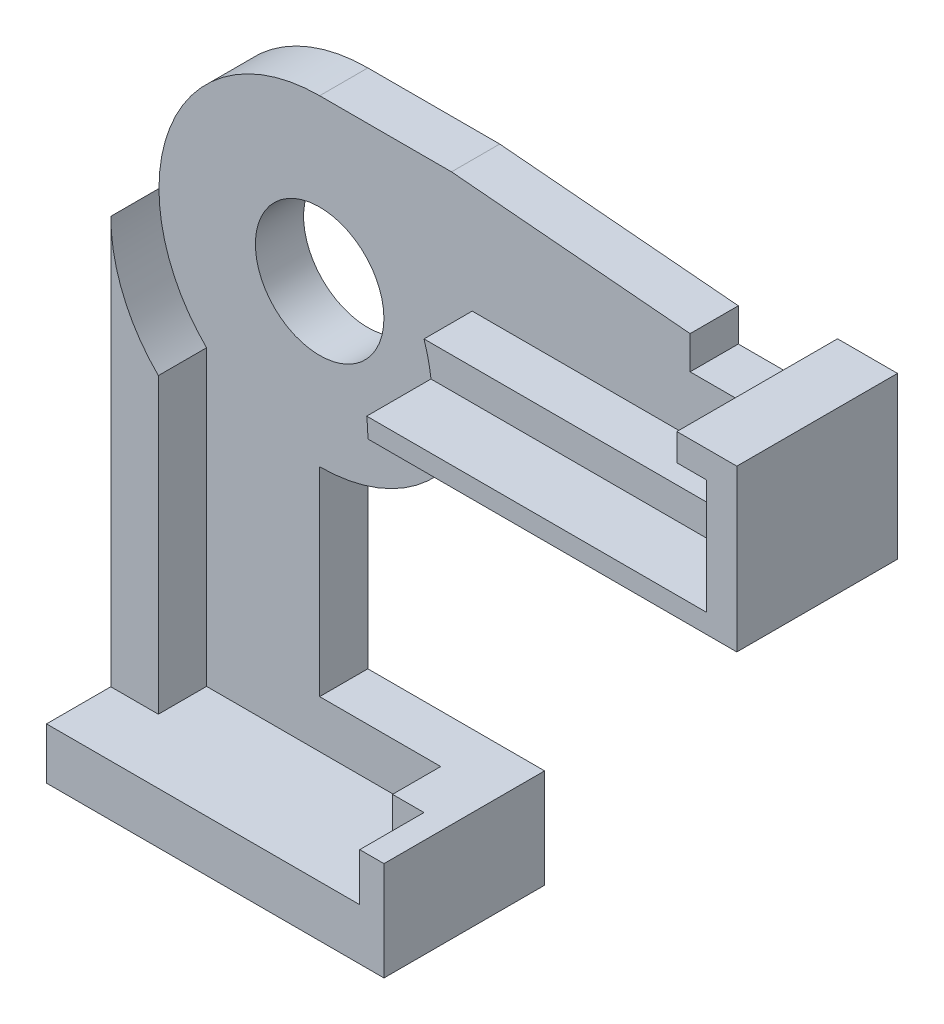
ISO-10303-21;
HEADER;
FILE_DESCRIPTION(('STEP AP214'),'2;1');
FILE_NAME('part.step','',(''),(''),'','','');
FILE_SCHEMA(('AUTOMOTIVE_DESIGN { 1 0 10303 214 1 1 1 1 }'));
ENDSEC;
DATA;
#1=APPLICATION_CONTEXT('core data for automotive mechanical design processes');
#2=APPLICATION_PROTOCOL_DEFINITION('international standard','automotive_design',2000,#1);
#3=PRODUCT_CONTEXT('',#1,'mechanical');
#4=PRODUCT('Part','Part','',(#3));
#5=PRODUCT_RELATED_PRODUCT_CATEGORY('part','',(#4));
#6=PRODUCT_DEFINITION_FORMATION('','',#4);
#7=PRODUCT_DEFINITION_CONTEXT('part definition',#1,'design');
#8=PRODUCT_DEFINITION('design','',#6,#7);
#9=PRODUCT_DEFINITION_SHAPE('','',#8);
#10=(LENGTH_UNIT() NAMED_UNIT(*) SI_UNIT(.MILLI.,.METRE.));
#11=(NAMED_UNIT(*) PLANE_ANGLE_UNIT() SI_UNIT($,.RADIAN.));
#12=(NAMED_UNIT(*) SI_UNIT($,.STERADIAN.) SOLID_ANGLE_UNIT());
#13=UNCERTAINTY_MEASURE_WITH_UNIT(LENGTH_MEASURE(1.E-05),#10,'distance_accuracy_value','');
#14=(GEOMETRIC_REPRESENTATION_CONTEXT(3) GLOBAL_UNCERTAINTY_ASSIGNED_CONTEXT((#13)) GLOBAL_UNIT_ASSIGNED_CONTEXT((#10,
#11,#12)) REPRESENTATION_CONTEXT('',''));
#15=CARTESIAN_POINT('',(0.,0.,0.));
#16=DIRECTION('',(0.,0.,1.));
#17=DIRECTION('',(1.,0.,0.));
#18=AXIS2_PLACEMENT_3D('',#15,#16,#17);
#19=CARTESIAN_POINT('',(0.,0.,1.5));
#20=DIRECTION('',(0.,0.,-1.));
#21=DIRECTION('',(-1.,0.,0.));
#22=AXIS2_PLACEMENT_3D('',#19,#20,#21);
#23=CYLINDRICAL_SURFACE('',#22,5.);
#24=DIRECTION('',(0.,0.,-1.));
#25=VECTOR('',#24,1.);
#26=CARTESIAN_POINT('',(-5.,0.,3.));
#27=LINE('',#26,#25);
#28=CARTESIAN_POINT('',(-5.,0.,1.5));
#29=VERTEX_POINT('',#28);
#30=CARTESIAN_POINT('',(-5.,0.,0.));
#31=VERTEX_POINT('',#30);
#32=EDGE_CURVE('E385',#29,#31,#27,.T.);
#33=ORIENTED_EDGE('',*,*,#32,.F.);
#34=CARTESIAN_POINT('',(0.,0.,1.5));
#35=DIRECTION('',(0.,0.,1.));
#36=DIRECTION('',(1.,0.,0.));
#37=AXIS2_PLACEMENT_3D('',#34,#35,#36);
#38=CIRCLE('',#37,5.);
#39=CARTESIAN_POINT('',(0.,5.,1.5));
#40=VERTEX_POINT('',#39);
#41=EDGE_CURVE('E401',#40,#29,#38,.T.);
#42=ORIENTED_EDGE('',*,*,#41,.F.);
#43=DIRECTION('',(0.,0.,-1.));
#44=VECTOR('',#43,1.);
#45=CARTESIAN_POINT('',(0.,5.,1.5));
#46=LINE('',#45,#44);
#47=CARTESIAN_POINT('',(0.,5.,0.));
#48=VERTEX_POINT('',#47);
#49=EDGE_CURVE('E453',#40,#48,#46,.T.);
#50=ORIENTED_EDGE('',*,*,#49,.T.);
#51=CARTESIAN_POINT('',(0.,0.,0.));
#52=DIRECTION('',(0.,0.,1.));
#53=DIRECTION('',(1.,0.,0.));
#54=AXIS2_PLACEMENT_3D('',#51,#52,#53);
#55=CIRCLE('',#54,5.);
#56=EDGE_CURVE('E434',#48,#31,#55,.T.);
#57=ORIENTED_EDGE('',*,*,#56,.T.);
#58=EDGE_LOOP('',(#33,#42,#50,#57));
#59=FACE_BOUND('',#58,.T.);
#60=ADVANCED_FACE('F35',(#59),#23,.T.);
#61=CARTESIAN_POINT('',(0.,-5.,0.));
#62=VERTEX_POINT('',#61);
#63=CARTESIAN_POINT('',(5.,0.,0.));
#64=VERTEX_POINT('',#63);
#65=EDGE_CURVE('E57',#62,#64,#55,.T.);
#66=ORIENTED_EDGE('',*,*,#65,.T.);
#67=DIRECTION('',(0.,0.,-1.));
#68=VECTOR('',#67,1.);
#69=CARTESIAN_POINT('',(5.,0.,5.));
#70=LINE('',#69,#68);
#71=CARTESIAN_POINT('',(5.,0.,1.5));
#72=VERTEX_POINT('',#71);
#73=EDGE_CURVE('E233',#72,#64,#70,.T.);
#74=ORIENTED_EDGE('',*,*,#73,.F.);
#75=CARTESIAN_POINT('',(0.,-5.,1.5));
#76=VERTEX_POINT('',#75);
#77=EDGE_CURVE('E396',#76,#72,#38,.T.);
#78=ORIENTED_EDGE('',*,*,#77,.F.);
#79=DIRECTION('',(0.,0.,-1.));
#80=VECTOR('',#79,1.);
#81=CARTESIAN_POINT('',(0.,-5.,1.5));
#82=LINE('',#81,#80);
#83=EDGE_CURVE('E429',#76,#62,#82,.T.);
#84=ORIENTED_EDGE('',*,*,#83,.T.);
#85=EDGE_LOOP('',(#66,#74,#78,#84));
#86=FACE_BOUND('',#85,.T.);
#87=ADVANCED_FACE('F498',(#86),#23,.T.);
#88=CARTESIAN_POINT('',(0.,3.32335172297812,1.5));
#89=DIRECTION('',(0.,1.,0.));
#90=DIRECTION('',(0.,0.,1.));
#91=AXIS2_PLACEMENT_3D('',#88,#89,#90);
#92=PLANE('',#91);
#93=DIRECTION('',(1.,0.,0.));
#94=VECTOR('',#93,1.);
#95=CARTESIAN_POINT('',(0.,3.32335172297812,0.));
#96=LINE('',#95,#94);
#97=CARTESIAN_POINT('',(11.5290629213235,3.32335172297812,0.));
#98=VERTEX_POINT('',#97);
#99=CARTESIAN_POINT('',(14.6162959832024,3.32335172297812,0.));
#100=VERTEX_POINT('',#99);
#101=EDGE_CURVE('E433',#98,#100,#96,.T.);
#102=ORIENTED_EDGE('',*,*,#101,.F.);
#103=DIRECTION('',(0.,0.,-1.));
#104=VECTOR('',#103,1.);
#105=CARTESIAN_POINT('',(11.5290629213235,3.32335172297812,1.5));
#106=LINE('',#105,#104);
#107=CARTESIAN_POINT('',(11.5290629213235,3.32335172297812,1.5));
#108=VERTEX_POINT('',#107);
#109=EDGE_CURVE('E43',#108,#98,#106,.T.);
#110=ORIENTED_EDGE('',*,*,#109,.F.);
#111=DIRECTION('',(1.,0.,0.));
#112=VECTOR('',#111,1.);
#113=CARTESIAN_POINT('',(0.,3.32335172297812,1.5));
#114=LINE('',#113,#112);
#115=CARTESIAN_POINT('',(14.6162959832024,3.32335172297812,1.5));
#116=VERTEX_POINT('',#115);
#117=EDGE_CURVE('E405',#108,#116,#114,.T.);
#118=ORIENTED_EDGE('',*,*,#117,.T.);
#119=DIRECTION('',(0.,0.,-1.));
#120=VECTOR('',#119,1.);
#121=CARTESIAN_POINT('',(14.6162959832024,3.32335172297812,1.5));
#122=LINE('',#121,#120);
#123=EDGE_CURVE('E11',#116,#100,#122,.T.);
#124=ORIENTED_EDGE('',*,*,#123,.T.);
#125=EDGE_LOOP('',(#102,#110,#118,#124));
#126=FACE_BOUND('',#125,.T.);
#127=ADVANCED_FACE('F465',(#126),#92,.T.);
#128=CARTESIAN_POINT('',(11.5290629213235,0.,1.5));
#129=DIRECTION('',(1.,0.,0.));
#130=DIRECTION('',(0.,0.,-1.));
#131=AXIS2_PLACEMENT_3D('',#128,#129,#130);
#132=PLANE('',#131);
#133=DIRECTION('',(0.,-1.,0.));
#134=VECTOR('',#133,1.);
#135=CARTESIAN_POINT('',(11.5290629213235,0.,0.));
#136=LINE('',#135,#134);
#137=CARTESIAN_POINT('',(11.5290629213235,4.3540103287596,0.));
#138=VERTEX_POINT('',#137);
#139=EDGE_CURVE('E437',#138,#98,#136,.T.);
#140=ORIENTED_EDGE('',*,*,#139,.F.);
#141=DIRECTION('',(0.,0.,-1.));
#142=VECTOR('',#141,1.);
#143=CARTESIAN_POINT('',(11.5290629213235,4.3540103287596,1.5));
#144=LINE('',#143,#142);
#145=CARTESIAN_POINT('',(11.5290629213235,4.3540103287596,1.5));
#146=VERTEX_POINT('',#145);
#147=EDGE_CURVE('E457',#146,#138,#144,.T.);
#148=ORIENTED_EDGE('',*,*,#147,.F.);
#149=DIRECTION('',(0.,-1.,0.));
#150=VECTOR('',#149,1.);
#151=CARTESIAN_POINT('',(11.5290629213235,0.,1.5));
#152=LINE('',#151,#150);
#153=EDGE_CURVE('E408',#146,#108,#152,.T.);
#154=ORIENTED_EDGE('',*,*,#153,.T.);
#155=ORIENTED_EDGE('',*,*,#109,.T.);
#156=EDGE_LOOP('',(#140,#148,#154,#155));
#157=FACE_BOUND('',#156,.T.);
#158=ADVANCED_FACE('F461',(#157),#132,.T.);
#159=CARTESIAN_POINT('',(0.46251294971073,5.31671441146433,1.5));
#160=DIRECTION('',(0.0866649431072124,0.99623751567396,0.));
#161=DIRECTION('',(-0.99623751567396,0.0866649431072125,0.));
#162=AXIS2_PLACEMENT_3D('',#159,#160,#161);
#163=PLANE('',#162);
#164=DIRECTION('',(0.99623751567396,-0.0866649431072125,0.));
#165=VECTOR('',#164,1.);
#166=CARTESIAN_POINT('',(0.46251294971073,5.31671441146433,0.));
#167=LINE('',#166,#165);
#168=CARTESIAN_POINT('',(4.10323279723935,5.,0.));
#169=VERTEX_POINT('',#168);
#170=EDGE_CURVE('E440',#169,#138,#167,.T.);
#171=ORIENTED_EDGE('',*,*,#170,.F.);
#172=DIRECTION('',(0.,0.,-1.));
#173=VECTOR('',#172,1.);
#174=CARTESIAN_POINT('',(4.10323279723935,5.,1.5));
#175=LINE('',#174,#173);
#176=CARTESIAN_POINT('',(4.10323279723935,5.,1.5));
#177=VERTEX_POINT('',#176);
#178=EDGE_CURVE('E455',#177,#169,#175,.T.);
#179=ORIENTED_EDGE('',*,*,#178,.F.);
#180=DIRECTION('',(0.99623751567396,-0.0866649431072125,0.));
#181=VECTOR('',#180,1.);
#182=CARTESIAN_POINT('',(0.46251294971073,5.31671441146433,1.5));
#183=LINE('',#182,#181);
#184=EDGE_CURVE('E411',#177,#146,#183,.T.);
#185=ORIENTED_EDGE('',*,*,#184,.T.);
#186=ORIENTED_EDGE('',*,*,#147,.T.);
#187=EDGE_LOOP('',(#171,#179,#185,#186));
#188=FACE_BOUND('',#187,.T.);
#189=ADVANCED_FACE('F475',(#188),#163,.T.);
#190=CARTESIAN_POINT('',(0.,5.,1.5));
#191=DIRECTION('',(0.,1.,0.));
#192=DIRECTION('',(-1.,0.,0.));
#193=AXIS2_PLACEMENT_3D('',#190,#191,#192);
#194=PLANE('',#193);
#195=DIRECTION('',(1.,0.,0.));
#196=VECTOR('',#195,1.);
#197=CARTESIAN_POINT('',(0.,5.,0.));
#198=LINE('',#197,#196);
#199=EDGE_CURVE('E443',#48,#169,#198,.T.);
#200=ORIENTED_EDGE('',*,*,#199,.F.);
#201=ORIENTED_EDGE('',*,*,#49,.F.);
#202=DIRECTION('',(1.,0.,0.));
#203=VECTOR('',#202,1.);
#204=CARTESIAN_POINT('',(0.,5.,1.5));
#205=LINE('',#204,#203);
#206=EDGE_CURVE('E414',#40,#177,#205,.T.);
#207=ORIENTED_EDGE('',*,*,#206,.T.);
#208=ORIENTED_EDGE('',*,*,#178,.T.);
#209=EDGE_LOOP('',(#200,#201,#207,#208));
#210=FACE_BOUND('',#209,.T.);
#211=ADVANCED_FACE('F567',(#210),#194,.T.);
#212=CARTESIAN_POINT('',(0.,-11.1942151254732,1.5));
#213=DIRECTION('',(0.,-1.,0.));
#214=DIRECTION('',(0.,0.,-1.));
#215=AXIS2_PLACEMENT_3D('',#212,#213,#214);
#216=PLANE('',#215);
#217=DIRECTION('',(-1.,0.,0.));
#218=VECTOR('',#217,1.);
#219=CARTESIAN_POINT('',(0.,-11.1942151254732,0.));
#220=LINE('',#219,#218);
#221=CARTESIAN_POINT('',(5.50118697358128,-11.1942151254732,0.));
#222=VERTEX_POINT('',#221);
#223=CARTESIAN_POINT('',(0.,-11.1942151254732,0.));
#224=VERTEX_POINT('',#223);
#225=EDGE_CURVE('E446',#222,#224,#220,.T.);
#226=ORIENTED_EDGE('',*,*,#225,.T.);
#227=DIRECTION('',(0.,0.,-1.));
#228=VECTOR('',#227,1.);
#229=CARTESIAN_POINT('',(0.,-11.1942151254732,1.5));
#230=LINE('',#229,#228);
#231=CARTESIAN_POINT('',(0.,-11.1942151254732,1.5));
#232=VERTEX_POINT('',#231);
#233=EDGE_CURVE('E450',#232,#224,#230,.T.);
#234=ORIENTED_EDGE('',*,*,#233,.F.);
#235=DIRECTION('',(-1.,0.,0.));
#236=VECTOR('',#235,1.);
#237=CARTESIAN_POINT('',(0.,-11.1942151254732,1.5));
#238=LINE('',#237,#236);
#239=CARTESIAN_POINT('',(3.76739439397743,-11.1942151254732,1.5));
#240=VERTEX_POINT('',#239);
#241=EDGE_CURVE('E425',#240,#232,#238,.T.);
#242=ORIENTED_EDGE('',*,*,#241,.F.);
#243=DIRECTION('',(0.,0.,-1.));
#244=VECTOR('',#243,1.);
#245=CARTESIAN_POINT('',(3.76739439397743,-11.1942151254732,3.));
#246=LINE('',#245,#244);
#247=CARTESIAN_POINT('',(3.76739439397743,-11.1942151254732,3.));
#248=VERTEX_POINT('',#247);
#249=EDGE_CURVE('E336',#248,#240,#246,.T.);
#250=ORIENTED_EDGE('',*,*,#249,.F.);
#251=DIRECTION('',(-1.,0.,0.));
#252=VECTOR('',#251,1.);
#253=CARTESIAN_POINT('',(0.,-11.1942151254732,3.));
#254=LINE('',#253,#252);
#255=CARTESIAN_POINT('',(4.74731666854759,-11.1942151254732,3.));
#256=VERTEX_POINT('',#255);
#257=EDGE_CURVE('E329',#256,#248,#254,.T.);
#258=ORIENTED_EDGE('',*,*,#257,.F.);
#259=DIRECTION('',(0.,0.,-1.));
#260=VECTOR('',#259,1.);
#261=CARTESIAN_POINT('',(4.74731666854759,-11.1942151254732,5.));
#262=LINE('',#261,#260);
#263=CARTESIAN_POINT('',(4.74731666854759,-11.1942151254732,5.));
#264=VERTEX_POINT('',#263);
#265=EDGE_CURVE('E304',#264,#256,#262,.T.);
#266=ORIENTED_EDGE('',*,*,#265,.F.);
#267=DIRECTION('',(-1.,0.,0.));
#268=VECTOR('',#267,1.);
#269=CARTESIAN_POINT('',(0.,-11.1942151254732,5.));
#270=LINE('',#269,#268);
#271=CARTESIAN_POINT('',(5.50118697358128,-11.1942151254732,5.));
#272=VERTEX_POINT('',#271);
#273=EDGE_CURVE('E302',#272,#264,#270,.T.);
#274=ORIENTED_EDGE('',*,*,#273,.F.);
#275=DIRECTION('',(0.,0.,-1.));
#276=VECTOR('',#275,1.);
#277=CARTESIAN_POINT('',(5.50118697358128,-11.1942151254732,5.));
#278=LINE('',#277,#276);
#279=EDGE_CURVE('E309',#272,#222,#278,.T.);
#280=ORIENTED_EDGE('',*,*,#279,.T.);
#281=EDGE_LOOP('',(#226,#234,#242,#250,#258,#266,#274,#280));
#282=FACE_BOUND('',#281,.T.);
#283=ADVANCED_FACE('F504',(#282),#216,.F.);
#284=CARTESIAN_POINT('',(0.,0.,1.5));
#285=DIRECTION('',(0.,0.,-1.));
#286=DIRECTION('',(-1.,0.,0.));
#287=AXIS2_PLACEMENT_3D('',#284,#285,#286);
#288=CYLINDRICAL_SURFACE('',#287,2.);
#289=CARTESIAN_POINT('',(0.,0.,1.5));
#290=DIRECTION('',(0.,0.,1.));
#291=DIRECTION('',(1.,0.,0.));
#292=AXIS2_PLACEMENT_3D('',#289,#290,#291);
#293=CIRCLE('',#292,2.);
#294=CARTESIAN_POINT('',(2.,0.,1.5));
#295=VERTEX_POINT('',#294);
#296=EDGE_CURVE('E393',#295,#295,#293,.T.);
#297=ORIENTED_EDGE('',*,*,#296,.T.);
#298=EDGE_LOOP('',(#297));
#299=FACE_BOUND('',#298,.T.);
#300=CARTESIAN_POINT('',(0.,0.,0.));
#301=DIRECTION('',(0.,0.,1.));
#302=DIRECTION('',(1.,0.,0.));
#303=AXIS2_PLACEMENT_3D('',#300,#301,#302);
#304=CIRCLE('',#303,2.);
#305=CARTESIAN_POINT('',(2.,0.,0.));
#306=VERTEX_POINT('',#305);
#307=EDGE_CURVE('E392',#306,#306,#304,.T.);
#308=ORIENTED_EDGE('',*,*,#307,.F.);
#309=EDGE_LOOP('',(#308));
#310=FACE_BOUND('',#309,.T.);
#311=ADVANCED_FACE('F37',(#299,#310),#288,.F.);
#312=CARTESIAN_POINT('',(0.,0.,1.5));
#313=DIRECTION('',(-1.,0.,0.));
#314=DIRECTION('',(0.,0.,1.));
#315=AXIS2_PLACEMENT_3D('',#312,#313,#314);
#316=PLANE('',#315);
#317=DIRECTION('',(0.,1.,0.));
#318=VECTOR('',#317,1.);
#319=CARTESIAN_POINT('',(0.,0.,0.));
#320=LINE('',#319,#318);
#321=EDGE_CURVE('E397',#224,#62,#320,.T.);
#322=ORIENTED_EDGE('',*,*,#321,.T.);
#323=ORIENTED_EDGE('',*,*,#83,.F.);
#324=DIRECTION('',(0.,1.,0.));
#325=VECTOR('',#324,1.);
#326=CARTESIAN_POINT('',(0.,0.,1.5));
#327=LINE('',#326,#325);
#328=EDGE_CURVE('E427',#232,#76,#327,.T.);
#329=ORIENTED_EDGE('',*,*,#328,.F.);
#330=ORIENTED_EDGE('',*,*,#233,.T.);
#331=EDGE_LOOP('',(#322,#323,#329,#330));
#332=FACE_BOUND('',#331,.T.);
#333=ADVANCED_FACE('F494',(#332),#316,.F.);
#334=CARTESIAN_POINT('',(0.,0.,1.5));
#335=DIRECTION('',(0.,0.,1.));
#336=DIRECTION('',(1.,0.,0.));
#337=AXIS2_PLACEMENT_3D('',#334,#335,#336);
#338=PLANE('',#337);
#339=ORIENTED_EDGE('',*,*,#296,.F.);
#340=EDGE_LOOP('',(#339));
#341=FACE_BOUND('',#340,.T.);
#342=ORIENTED_EDGE('',*,*,#77,.T.);
#343=CARTESIAN_POINT('',(0.,0.,1.5));
#344=DIRECTION('',(0.,0.,1.));
#345=DIRECTION('',(1.,0.,0.));
#346=AXIS2_PLACEMENT_3D('',#343,#344,#345);
#347=CIRCLE('',#346,5.);
#348=CARTESIAN_POINT('',(4.74731666854759,1.56938983319321,1.5));
#349=VERTEX_POINT('',#348);
#350=EDGE_CURVE('E50',#349,#72,#347,.F.);
#351=ORIENTED_EDGE('',*,*,#350,.F.);
#352=DIRECTION('',(1.,0.,0.));
#353=VECTOR('',#352,1.);
#354=CARTESIAN_POINT('',(0.,1.56938983319321,1.5));
#355=LINE('',#354,#353);
#356=CARTESIAN_POINT('',(14.6162959832024,1.56938983319321,1.5));
#357=VERTEX_POINT('',#356);
#358=EDGE_CURVE('E400',#349,#357,#355,.T.);
#359=ORIENTED_EDGE('',*,*,#358,.T.);
#360=DIRECTION('',(0.,1.,0.));
#361=VECTOR('',#360,1.);
#362=CARTESIAN_POINT('',(14.6162959832024,0.,1.5));
#363=LINE('',#362,#361);
#364=EDGE_CURVE('E403',#357,#116,#363,.T.);
#365=ORIENTED_EDGE('',*,*,#364,.T.);
#366=ORIENTED_EDGE('',*,*,#117,.F.);
#367=ORIENTED_EDGE('',*,*,#153,.F.);
#368=ORIENTED_EDGE('',*,*,#184,.F.);
#369=ORIENTED_EDGE('',*,*,#206,.F.);
#370=ORIENTED_EDGE('',*,*,#41,.T.);
#371=CARTESIAN_POINT('',(0.,0.,1.5));
#372=DIRECTION('',(0.,0.,1.));
#373=DIRECTION('',(1.,0.,0.));
#374=AXIS2_PLACEMENT_3D('',#371,#372,#373);
#375=CIRCLE('',#374,5.);
#376=CARTESIAN_POINT('',(-3.51918966004233,-3.55180294169752,1.5));
#377=VERTEX_POINT('',#376);
#378=EDGE_CURVE('E389',#377,#29,#375,.F.);
#379=ORIENTED_EDGE('',*,*,#378,.F.);
#380=DIRECTION('',(0.,-1.,0.));
#381=VECTOR('',#380,1.);
#382=CARTESIAN_POINT('',(-3.51918966004233,0.,1.5));
#383=LINE('',#382,#381);
#384=CARTESIAN_POINT('',(-3.51918966004233,-12.6782021060283,1.5));
#385=VERTEX_POINT('',#384);
#386=EDGE_CURVE('E417',#377,#385,#383,.T.);
#387=ORIENTED_EDGE('',*,*,#386,.T.);
#388=DIRECTION('',(1.,0.,0.));
#389=VECTOR('',#388,1.);
#390=CARTESIAN_POINT('',(0.,-12.6782021060283,1.5));
#391=LINE('',#390,#389);
#392=CARTESIAN_POINT('',(3.76739439397743,-12.6782021060283,1.5));
#393=VERTEX_POINT('',#392);
#394=EDGE_CURVE('E420',#385,#393,#391,.T.);
#395=ORIENTED_EDGE('',*,*,#394,.T.);
#396=DIRECTION('',(0.,1.,0.));
#397=VECTOR('',#396,1.);
#398=CARTESIAN_POINT('',(3.76739439397743,0.,1.5));
#399=LINE('',#398,#397);
#400=EDGE_CURVE('E423',#393,#240,#399,.T.);
#401=ORIENTED_EDGE('',*,*,#400,.T.);
#402=ORIENTED_EDGE('',*,*,#241,.T.);
#403=ORIENTED_EDGE('',*,*,#328,.T.);
#404=EDGE_LOOP('',(#342,#351,#359,#365,#366,#367,#368,#369,#370,#379,#387,#395,#401,#402,#403));
#405=FACE_BOUND('',#404,.T.);
#406=ADVANCED_FACE('F478',(#341,#405),#338,.T.);
#407=CARTESIAN_POINT('',(0.,0.,0.));
#408=DIRECTION('',(0.,0.,1.));
#409=DIRECTION('',(1.,0.,0.));
#410=AXIS2_PLACEMENT_3D('',#407,#408,#409);
#411=PLANE('',#410);
#412=DIRECTION('',(-1.,0.,0.));
#413=VECTOR('',#412,1.);
#414=CARTESIAN_POINT('',(0.,0.,0.));
#415=LINE('',#414,#413);
#416=CARTESIAN_POINT('',(16.4819353477846,0.,0.));
#417=VERTEX_POINT('',#416);
#418=EDGE_CURVE('E265',#417,#64,#415,.T.);
#419=ORIENTED_EDGE('',*,*,#418,.T.);
#420=ORIENTED_EDGE('',*,*,#65,.F.);
#421=ORIENTED_EDGE('',*,*,#321,.F.);
#422=ORIENTED_EDGE('',*,*,#225,.F.);
#423=DIRECTION('',(0.,1.,0.));
#424=VECTOR('',#423,1.);
#425=CARTESIAN_POINT('',(5.50118697358128,0.,0.));
#426=LINE('',#425,#424);
#427=CARTESIAN_POINT('',(5.50118697358128,-14.2766801600238,0.));
#428=VERTEX_POINT('',#427);
#429=EDGE_CURVE('E293',#428,#222,#426,.T.);
#430=ORIENTED_EDGE('',*,*,#429,.F.);
#431=DIRECTION('',(1.,0.,0.));
#432=VECTOR('',#431,1.);
#433=CARTESIAN_POINT('',(0.,-14.2766801600238,0.));
#434=LINE('',#433,#432);
#435=CARTESIAN_POINT('',(-5.,-14.2766801600238,0.));
#436=VERTEX_POINT('',#435);
#437=EDGE_CURVE('E232',#436,#428,#434,.T.);
#438=ORIENTED_EDGE('',*,*,#437,.F.);
#439=DIRECTION('',(0.,-1.,0.));
#440=VECTOR('',#439,1.);
#441=CARTESIAN_POINT('',(-5.,0.,0.));
#442=LINE('',#441,#440);
#443=EDGE_CURVE('E365',#31,#436,#442,.T.);
#444=ORIENTED_EDGE('',*,*,#443,.F.);
#445=ORIENTED_EDGE('',*,*,#56,.F.);
#446=ORIENTED_EDGE('',*,*,#199,.T.);
#447=ORIENTED_EDGE('',*,*,#170,.T.);
#448=ORIENTED_EDGE('',*,*,#139,.T.);
#449=ORIENTED_EDGE('',*,*,#101,.T.);
#450=DIRECTION('',(0.,1.,0.));
#451=VECTOR('',#450,1.);
#452=CARTESIAN_POINT('',(14.6162959832024,0.,0.));
#453=LINE('',#452,#451);
#454=CARTESIAN_POINT('',(14.6162959832024,5.00819784370757,0.));
#455=VERTEX_POINT('',#454);
#456=EDGE_CURVE('E339',#100,#455,#453,.T.);
#457=ORIENTED_EDGE('',*,*,#456,.T.);
#458=DIRECTION('',(1.,0.,0.));
#459=VECTOR('',#458,1.);
#460=CARTESIAN_POINT('',(0.,5.00819784370757,0.));
#461=LINE('',#460,#459);
#462=CARTESIAN_POINT('',(16.4819353477846,5.00819784370757,0.));
#463=VERTEX_POINT('',#462);
#464=EDGE_CURVE('E244',#455,#463,#461,.T.);
#465=ORIENTED_EDGE('',*,*,#464,.T.);
#466=DIRECTION('',(0.,-1.,0.));
#467=VECTOR('',#466,1.);
#468=CARTESIAN_POINT('',(16.4819353477846,0.,0.));
#469=LINE('',#468,#467);
#470=EDGE_CURVE('E268',#463,#417,#469,.T.);
#471=ORIENTED_EDGE('',*,*,#470,.T.);
#472=EDGE_LOOP('',(#419,#420,#421,#422,#430,#438,#444,#445,#446,#447,#448,#449,#457,#465,#471));
#473=FACE_BOUND('',#472,.T.);
#474=ORIENTED_EDGE('',*,*,#307,.T.);
#475=EDGE_LOOP('',(#474));
#476=FACE_BOUND('',#475,.T.);
#477=ADVANCED_FACE('F469',(#473,#476),#411,.F.);
#478=CARTESIAN_POINT('',(0.,0.,3.));
#479=DIRECTION('',(0.,0.,-1.));
#480=DIRECTION('',(-1.,0.,0.));
#481=AXIS2_PLACEMENT_3D('',#478,#479,#480);
#482=CYLINDRICAL_SURFACE('',#481,5.);
#483=DIRECTION('',(0.,0.,-1.));
#484=VECTOR('',#483,1.);
#485=CARTESIAN_POINT('',(-3.51918966004233,-3.55180294169752,3.));
#486=LINE('',#485,#484);
#487=CARTESIAN_POINT('',(-3.51918966004233,-3.55180294169752,3.));
#488=VERTEX_POINT('',#487);
#489=EDGE_CURVE('E378',#488,#377,#486,.T.);
#490=ORIENTED_EDGE('',*,*,#489,.T.);
#491=ORIENTED_EDGE('',*,*,#378,.T.);
#492=CARTESIAN_POINT('',(-5.,0.,3.));
#493=VERTEX_POINT('',#492);
#494=EDGE_CURVE('E386',#493,#29,#27,.T.);
#495=ORIENTED_EDGE('',*,*,#494,.F.);
#496=CARTESIAN_POINT('',(0.,0.,3.));
#497=DIRECTION('',(0.,0.,1.));
#498=DIRECTION('',(1.,0.,0.));
#499=AXIS2_PLACEMENT_3D('',#496,#497,#498);
#500=CIRCLE('',#499,5.);
#501=EDGE_CURVE('E366',#493,#488,#500,.T.);
#502=ORIENTED_EDGE('',*,*,#501,.T.);
#503=EDGE_LOOP('',(#490,#491,#495,#502));
#504=FACE_BOUND('',#503,.T.);
#505=ADVANCED_FACE('F529',(#504),#482,.F.);
#506=CARTESIAN_POINT('',(-5.,0.,3.));
#507=DIRECTION('',(1.,0.,0.));
#508=DIRECTION('',(0.,0.,-1.));
#509=AXIS2_PLACEMENT_3D('',#506,#507,#508);
#510=PLANE('',#509);
#511=ORIENTED_EDGE('',*,*,#443,.T.);
#512=DIRECTION('',(0.,0.,-1.));
#513=VECTOR('',#512,1.);
#514=CARTESIAN_POINT('',(-5.,-14.2766801600238,5.));
#515=LINE('',#514,#513);
#516=CARTESIAN_POINT('',(-5.,-14.2766801600238,5.));
#517=VERTEX_POINT('',#516);
#518=EDGE_CURVE('E315',#517,#436,#515,.T.);
#519=ORIENTED_EDGE('',*,*,#518,.F.);
#520=DIRECTION('',(0.,-1.,0.));
#521=VECTOR('',#520,1.);
#522=CARTESIAN_POINT('',(-5.,0.,5.));
#523=LINE('',#522,#521);
#524=CARTESIAN_POINT('',(-5.,-12.6782021060283,5.));
#525=VERTEX_POINT('',#524);
#526=EDGE_CURVE('E296',#525,#517,#523,.T.);
#527=ORIENTED_EDGE('',*,*,#526,.F.);
#528=DIRECTION('',(0.,0.,-1.));
#529=VECTOR('',#528,1.);
#530=CARTESIAN_POINT('',(-5.,-12.6782021060283,5.));
#531=LINE('',#530,#529);
#532=CARTESIAN_POINT('',(-5.,-12.6782021060283,3.));
#533=VERTEX_POINT('',#532);
#534=EDGE_CURVE('E318',#525,#533,#531,.T.);
#535=ORIENTED_EDGE('',*,*,#534,.T.);
#536=DIRECTION('',(0.,-1.,0.));
#537=VECTOR('',#536,1.);
#538=CARTESIAN_POINT('',(-5.,0.,3.));
#539=LINE('',#538,#537);
#540=EDGE_CURVE('E369',#493,#533,#539,.T.);
#541=ORIENTED_EDGE('',*,*,#540,.F.);
#542=ORIENTED_EDGE('',*,*,#494,.T.);
#543=ORIENTED_EDGE('',*,*,#32,.T.);
#544=EDGE_LOOP('',(#511,#519,#527,#535,#541,#542,#543));
#545=FACE_BOUND('',#544,.T.);
#546=ADVANCED_FACE('F520',(#545),#510,.F.);
#547=CARTESIAN_POINT('',(-3.51918966004233,0.,3.));
#548=DIRECTION('',(1.,0.,0.));
#549=DIRECTION('',(0.,0.,-1.));
#550=AXIS2_PLACEMENT_3D('',#547,#548,#549);
#551=PLANE('',#550);
#552=DIRECTION('',(0.,0.,-1.));
#553=VECTOR('',#552,1.);
#554=CARTESIAN_POINT('',(-3.51918966004233,-12.6782021060283,3.));
#555=LINE('',#554,#553);
#556=CARTESIAN_POINT('',(-3.51918966004233,-12.6782021060283,3.));
#557=VERTEX_POINT('',#556);
#558=EDGE_CURVE('E382',#557,#385,#555,.T.);
#559=ORIENTED_EDGE('',*,*,#558,.T.);
#560=ORIENTED_EDGE('',*,*,#386,.F.);
#561=ORIENTED_EDGE('',*,*,#489,.F.);
#562=DIRECTION('',(0.,-1.,0.));
#563=VECTOR('',#562,1.);
#564=CARTESIAN_POINT('',(-3.51918966004233,0.,3.));
#565=LINE('',#564,#563);
#566=EDGE_CURVE('E375',#488,#557,#565,.T.);
#567=ORIENTED_EDGE('',*,*,#566,.T.);
#568=EDGE_LOOP('',(#559,#560,#561,#567));
#569=FACE_BOUND('',#568,.T.);
#570=ADVANCED_FACE('F533',(#569),#551,.T.);
#571=CARTESIAN_POINT('',(0.,0.,3.));
#572=DIRECTION('',(0.,0.,1.));
#573=DIRECTION('',(1.,0.,0.));
#574=AXIS2_PLACEMENT_3D('',#571,#572,#573);
#575=PLANE('',#574);
#576=ORIENTED_EDGE('',*,*,#501,.F.);
#577=ORIENTED_EDGE('',*,*,#540,.T.);
#578=DIRECTION('',(1.,0.,0.));
#579=VECTOR('',#578,1.);
#580=CARTESIAN_POINT('',(0.,-12.6782021060283,3.));
#581=LINE('',#580,#579);
#582=EDGE_CURVE('E372',#533,#557,#581,.T.);
#583=ORIENTED_EDGE('',*,*,#582,.T.);
#584=ORIENTED_EDGE('',*,*,#566,.F.);
#585=EDGE_LOOP('',(#576,#577,#583,#584));
#586=FACE_BOUND('',#585,.T.);
#587=ADVANCED_FACE('F550',(#586),#575,.T.);
#588=CARTESIAN_POINT('',(0.,0.,3.));
#589=DIRECTION('',(0.,0.,-1.));
#590=DIRECTION('',(-1.,0.,0.));
#591=AXIS2_PLACEMENT_3D('',#588,#589,#590);
#592=CYLINDRICAL_SURFACE('',#591,5.);
#593=DIRECTION('',(0.,0.,-1.));
#594=VECTOR('',#593,1.);
#595=CARTESIAN_POINT('',(4.74731666854759,1.56938983319321,3.));
#596=LINE('',#595,#594);
#597=CARTESIAN_POINT('',(4.74731666854759,1.56938983319321,3.));
#598=VERTEX_POINT('',#597);
#599=EDGE_CURVE('E358',#598,#349,#596,.T.);
#600=ORIENTED_EDGE('',*,*,#599,.T.);
#601=ORIENTED_EDGE('',*,*,#350,.T.);
#602=CARTESIAN_POINT('',(5.,0.,5.));
#603=VERTEX_POINT('',#602);
#604=EDGE_CURVE('E225',#603,#72,#70,.T.);
#605=ORIENTED_EDGE('',*,*,#604,.F.);
#606=CARTESIAN_POINT('',(0.,0.,5.));
#607=DIRECTION('',(0.,0.,1.));
#608=DIRECTION('',(1.,0.,0.));
#609=AXIS2_PLACEMENT_3D('',#606,#607,#608);
#610=CIRCLE('',#609,5.);
#611=CARTESIAN_POINT('',(4.96417283728976,0.59748476257937,5.));
#612=VERTEX_POINT('',#611);
#613=EDGE_CURVE('E229',#603,#612,#610,.T.);
#614=ORIENTED_EDGE('',*,*,#613,.T.);
#615=DIRECTION('',(0.,0.,-1.));
#616=VECTOR('',#615,1.);
#617=CARTESIAN_POINT('',(4.96417283728976,0.59748476257937,5.));
#618=LINE('',#617,#616);
#619=CARTESIAN_POINT('',(4.96417283728976,0.59748476257937,3.));
#620=VERTEX_POINT('',#619);
#621=EDGE_CURVE('E264',#612,#620,#618,.T.);
#622=ORIENTED_EDGE('',*,*,#621,.T.);
#623=CARTESIAN_POINT('',(0.,0.,3.));
#624=DIRECTION('',(0.,0.,1.));
#625=DIRECTION('',(1.,0.,0.));
#626=AXIS2_PLACEMENT_3D('',#623,#624,#625);
#627=CIRCLE('',#626,5.);
#628=EDGE_CURVE('E340',#620,#598,#627,.T.);
#629=ORIENTED_EDGE('',*,*,#628,.T.);
#630=EDGE_LOOP('',(#600,#601,#605,#614,#622,#629));
#631=FACE_BOUND('',#630,.T.);
#632=ADVANCED_FACE('F227',(#631),#592,.F.);
#633=CARTESIAN_POINT('',(14.6162959832024,0.,3.));
#634=DIRECTION('',(-1.,0.,0.));
#635=DIRECTION('',(0.,0.,1.));
#636=AXIS2_PLACEMENT_3D('',#633,#634,#635);
#637=PLANE('',#636);
#638=ORIENTED_EDGE('',*,*,#456,.F.);
#639=ORIENTED_EDGE('',*,*,#123,.F.);
#640=ORIENTED_EDGE('',*,*,#364,.F.);
#641=DIRECTION('',(0.,0.,-1.));
#642=VECTOR('',#641,1.);
#643=CARTESIAN_POINT('',(14.6162959832024,1.56938983319321,3.));
#644=LINE('',#643,#642);
#645=CARTESIAN_POINT('',(14.6162959832024,1.56938983319321,3.));
#646=VERTEX_POINT('',#645);
#647=EDGE_CURVE('E361',#646,#357,#644,.T.);
#648=ORIENTED_EDGE('',*,*,#647,.F.);
#649=DIRECTION('',(0.,1.,0.));
#650=VECTOR('',#649,1.);
#651=CARTESIAN_POINT('',(14.6162959832024,0.,3.));
#652=LINE('',#651,#650);
#653=CARTESIAN_POINT('',(14.6162959832024,4.16577478334285,3.));
#654=VERTEX_POINT('',#653);
#655=EDGE_CURVE('E352',#646,#654,#652,.T.);
#656=ORIENTED_EDGE('',*,*,#655,.T.);
#657=DIRECTION('',(0.,0.,-1.));
#658=VECTOR('',#657,1.);
#659=CARTESIAN_POINT('',(14.6162959832024,4.16577478334285,5.));
#660=LINE('',#659,#658);
#661=CARTESIAN_POINT('',(14.6162959832024,4.16577478334285,5.));
#662=VERTEX_POINT('',#661);
#663=EDGE_CURVE('E280',#662,#654,#660,.T.);
#664=ORIENTED_EDGE('',*,*,#663,.F.);
#665=DIRECTION('',(0.,1.,0.));
#666=VECTOR('',#665,1.);
#667=CARTESIAN_POINT('',(14.6162959832024,0.,5.));
#668=LINE('',#667,#666);
#669=CARTESIAN_POINT('',(14.6162959832024,5.00819784370757,5.));
#670=VERTEX_POINT('',#669);
#671=EDGE_CURVE('E256',#662,#670,#668,.T.);
#672=ORIENTED_EDGE('',*,*,#671,.T.);
#673=DIRECTION('',(0.,0.,-1.));
#674=VECTOR('',#673,1.);
#675=CARTESIAN_POINT('',(14.6162959832024,5.00819784370757,5.));
#676=LINE('',#675,#674);
#677=EDGE_CURVE('E283',#670,#455,#676,.T.);
#678=ORIENTED_EDGE('',*,*,#677,.T.);
#679=EDGE_LOOP('',(#638,#639,#640,#648,#656,#664,#672,#678));
#680=FACE_BOUND('',#679,.T.);
#681=ADVANCED_FACE('F482',(#680),#637,.T.);
#682=CARTESIAN_POINT('',(0.,1.56938983319321,3.));
#683=DIRECTION('',(0.,1.,0.));
#684=DIRECTION('',(0.,0.,1.));
#685=AXIS2_PLACEMENT_3D('',#682,#683,#684);
#686=PLANE('',#685);
#687=ORIENTED_EDGE('',*,*,#647,.T.);
#688=ORIENTED_EDGE('',*,*,#358,.F.);
#689=ORIENTED_EDGE('',*,*,#599,.F.);
#690=DIRECTION('',(1.,0.,0.));
#691=VECTOR('',#690,1.);
#692=CARTESIAN_POINT('',(0.,1.56938983319321,3.));
#693=LINE('',#692,#691);
#694=EDGE_CURVE('E355',#598,#646,#693,.T.);
#695=ORIENTED_EDGE('',*,*,#694,.T.);
#696=EDGE_LOOP('',(#687,#688,#689,#695));
#697=FACE_BOUND('',#696,.T.);
#698=ADVANCED_FACE('F658',(#697),#686,.T.);
#699=CARTESIAN_POINT('',(0.,0.,3.));
#700=DIRECTION('',(0.,0.,1.));
#701=DIRECTION('',(1.,0.,0.));
#702=AXIS2_PLACEMENT_3D('',#699,#700,#701);
#703=PLANE('',#702);
#704=ORIENTED_EDGE('',*,*,#628,.F.);
#705=DIRECTION('',(-1.,0.,0.));
#706=VECTOR('',#705,1.);
#707=CARTESIAN_POINT('',(0.,0.59748476257937,3.));
#708=LINE('',#707,#706);
#709=CARTESIAN_POINT('',(15.5421893833179,0.59748476257937,3.));
#710=VERTEX_POINT('',#709);
#711=EDGE_CURVE('E343',#710,#620,#708,.T.);
#712=ORIENTED_EDGE('',*,*,#711,.F.);
#713=DIRECTION('',(0.,-1.,0.));
#714=VECTOR('',#713,1.);
#715=CARTESIAN_POINT('',(15.5421893833179,0.,3.));
#716=LINE('',#715,#714);
#717=CARTESIAN_POINT('',(15.5421893833179,4.16577478334285,3.));
#718=VERTEX_POINT('',#717);
#719=EDGE_CURVE('E346',#718,#710,#716,.T.);
#720=ORIENTED_EDGE('',*,*,#719,.F.);
#721=DIRECTION('',(1.,0.,0.));
#722=VECTOR('',#721,1.);
#723=CARTESIAN_POINT('',(0.,4.16577478334285,3.));
#724=LINE('',#723,#722);
#725=EDGE_CURVE('E349',#654,#718,#724,.T.);
#726=ORIENTED_EDGE('',*,*,#725,.F.);
#727=ORIENTED_EDGE('',*,*,#655,.F.);
#728=ORIENTED_EDGE('',*,*,#694,.F.);
#729=EDGE_LOOP('',(#704,#712,#720,#726,#727,#728));
#730=FACE_BOUND('',#729,.T.);
#731=ADVANCED_FACE('F666',(#730),#703,.T.);
#732=CARTESIAN_POINT('',(3.76739439397743,0.,3.));
#733=DIRECTION('',(-1.,0.,0.));
#734=DIRECTION('',(0.,0.,1.));
#735=AXIS2_PLACEMENT_3D('',#732,#733,#734);
#736=PLANE('',#735);
#737=ORIENTED_EDGE('',*,*,#249,.T.);
#738=ORIENTED_EDGE('',*,*,#400,.F.);
#739=DIRECTION('',(0.,0.,-1.));
#740=VECTOR('',#739,1.);
#741=CARTESIAN_POINT('',(3.76739439397743,-12.6782021060283,3.));
#742=LINE('',#741,#740);
#743=CARTESIAN_POINT('',(3.76739439397743,-12.6782021060283,3.));
#744=VERTEX_POINT('',#743);
#745=EDGE_CURVE('E334',#744,#393,#742,.T.);
#746=ORIENTED_EDGE('',*,*,#745,.F.);
#747=DIRECTION('',(0.,1.,0.));
#748=VECTOR('',#747,1.);
#749=CARTESIAN_POINT('',(3.76739439397743,0.,3.));
#750=LINE('',#749,#748);
#751=EDGE_CURVE('E331',#744,#248,#750,.T.);
#752=ORIENTED_EDGE('',*,*,#751,.T.);
#753=EDGE_LOOP('',(#737,#738,#746,#752));
#754=FACE_BOUND('',#753,.T.);
#755=ADVANCED_FACE('F537',(#754),#736,.T.);
#756=CARTESIAN_POINT('',(0.,0.,3.));
#757=DIRECTION('',(0.,0.,1.));
#758=DIRECTION('',(1.,0.,0.));
#759=AXIS2_PLACEMENT_3D('',#756,#757,#758);
#760=PLANE('',#759);
#761=DIRECTION('',(1.,0.,0.));
#762=VECTOR('',#761,1.);
#763=CARTESIAN_POINT('',(0.,-12.6782021060283,3.));
#764=LINE('',#763,#762);
#765=CARTESIAN_POINT('',(4.74731666854759,-12.6782021060283,3.));
#766=VERTEX_POINT('',#765);
#767=EDGE_CURVE('E323',#744,#766,#764,.T.);
#768=ORIENTED_EDGE('',*,*,#767,.T.);
#769=DIRECTION('',(0.,1.,0.));
#770=VECTOR('',#769,1.);
#771=CARTESIAN_POINT('',(4.74731666854759,0.,3.));
#772=LINE('',#771,#770);
#773=EDGE_CURVE('E326',#766,#256,#772,.T.);
#774=ORIENTED_EDGE('',*,*,#773,.T.);
#775=ORIENTED_EDGE('',*,*,#257,.T.);
#776=ORIENTED_EDGE('',*,*,#751,.F.);
#777=EDGE_LOOP('',(#768,#774,#775,#776));
#778=FACE_BOUND('',#777,.T.);
#779=ADVANCED_FACE('F541',(#778),#760,.T.);
#780=CARTESIAN_POINT('',(4.74731666854759,0.,5.));
#781=DIRECTION('',(-1.,0.,0.));
#782=DIRECTION('',(0.,0.,1.));
#783=AXIS2_PLACEMENT_3D('',#780,#781,#782);
#784=PLANE('',#783);
#785=ORIENTED_EDGE('',*,*,#265,.T.);
#786=ORIENTED_EDGE('',*,*,#773,.F.);
#787=DIRECTION('',(0.,0.,-1.));
#788=VECTOR('',#787,1.);
#789=CARTESIAN_POINT('',(4.74731666854759,-12.6782021060283,5.));
#790=LINE('',#789,#788);
#791=CARTESIAN_POINT('',(4.74731666854759,-12.6782021060283,5.));
#792=VERTEX_POINT('',#791);
#793=EDGE_CURVE('E321',#792,#766,#790,.T.);
#794=ORIENTED_EDGE('',*,*,#793,.F.);
#795=DIRECTION('',(0.,1.,0.));
#796=VECTOR('',#795,1.);
#797=CARTESIAN_POINT('',(4.74731666854759,0.,5.));
#798=LINE('',#797,#796);
#799=EDGE_CURVE('E289',#792,#264,#798,.T.);
#800=ORIENTED_EDGE('',*,*,#799,.T.);
#801=EDGE_LOOP('',(#785,#786,#794,#800));
#802=FACE_BOUND('',#801,.T.);
#803=ADVANCED_FACE('F544',(#802),#784,.T.);
#804=CARTESIAN_POINT('',(0.,-12.6782021060283,5.));
#805=DIRECTION('',(0.,1.,0.));
#806=DIRECTION('',(0.,0.,1.));
#807=AXIS2_PLACEMENT_3D('',#804,#805,#806);
#808=PLANE('',#807);
#809=ORIENTED_EDGE('',*,*,#558,.F.);
#810=ORIENTED_EDGE('',*,*,#582,.F.);
#811=ORIENTED_EDGE('',*,*,#534,.F.);
#812=DIRECTION('',(1.,0.,0.));
#813=VECTOR('',#812,1.);
#814=CARTESIAN_POINT('',(0.,-12.6782021060283,5.));
#815=LINE('',#814,#813);
#816=EDGE_CURVE('E292',#525,#792,#815,.T.);
#817=ORIENTED_EDGE('',*,*,#816,.T.);
#818=ORIENTED_EDGE('',*,*,#793,.T.);
#819=ORIENTED_EDGE('',*,*,#767,.F.);
#820=ORIENTED_EDGE('',*,*,#745,.T.);
#821=ORIENTED_EDGE('',*,*,#394,.F.);
#822=EDGE_LOOP('',(#809,#810,#811,#817,#818,#819,#820,#821));
#823=FACE_BOUND('',#822,.T.);
#824=ADVANCED_FACE('F548',(#823),#808,.T.);
#825=CARTESIAN_POINT('',(0.,-14.2766801600238,5.));
#826=DIRECTION('',(0.,1.,0.));
#827=DIRECTION('',(0.,0.,1.));
#828=AXIS2_PLACEMENT_3D('',#825,#826,#827);
#829=PLANE('',#828);
#830=ORIENTED_EDGE('',*,*,#437,.T.);
#831=DIRECTION('',(0.,0.,-1.));
#832=VECTOR('',#831,1.);
#833=CARTESIAN_POINT('',(5.50118697358128,-14.2766801600238,5.));
#834=LINE('',#833,#832);
#835=CARTESIAN_POINT('',(5.50118697358128,-14.2766801600238,5.));
#836=VERTEX_POINT('',#835);
#837=EDGE_CURVE('E312',#836,#428,#834,.T.);
#838=ORIENTED_EDGE('',*,*,#837,.F.);
#839=DIRECTION('',(1.,0.,0.));
#840=VECTOR('',#839,1.);
#841=CARTESIAN_POINT('',(0.,-14.2766801600238,5.));
#842=LINE('',#841,#840);
#843=EDGE_CURVE('E298',#517,#836,#842,.T.);
#844=ORIENTED_EDGE('',*,*,#843,.F.);
#845=ORIENTED_EDGE('',*,*,#518,.T.);
#846=EDGE_LOOP('',(#830,#838,#844,#845));
#847=FACE_BOUND('',#846,.T.);
#848=ADVANCED_FACE('F515',(#847),#829,.F.);
#849=CARTESIAN_POINT('',(5.50118697358128,0.,5.));
#850=DIRECTION('',(-1.,0.,0.));
#851=DIRECTION('',(0.,0.,1.));
#852=AXIS2_PLACEMENT_3D('',#849,#850,#851);
#853=PLANE('',#852);
#854=ORIENTED_EDGE('',*,*,#429,.T.);
#855=ORIENTED_EDGE('',*,*,#279,.F.);
#856=DIRECTION('',(0.,1.,0.));
#857=VECTOR('',#856,1.);
#858=CARTESIAN_POINT('',(5.50118697358128,0.,5.));
#859=LINE('',#858,#857);
#860=EDGE_CURVE('E300',#836,#272,#859,.T.);
#861=ORIENTED_EDGE('',*,*,#860,.F.);
#862=ORIENTED_EDGE('',*,*,#837,.T.);
#863=EDGE_LOOP('',(#854,#855,#861,#862));
#864=FACE_BOUND('',#863,.T.);
#865=ADVANCED_FACE('F510',(#864),#853,.F.);
#866=CARTESIAN_POINT('',(0.,0.,5.));
#867=DIRECTION('',(0.,0.,1.));
#868=DIRECTION('',(1.,0.,0.));
#869=AXIS2_PLACEMENT_3D('',#866,#867,#868);
#870=PLANE('',#869);
#871=ORIENTED_EDGE('',*,*,#799,.F.);
#872=ORIENTED_EDGE('',*,*,#816,.F.);
#873=ORIENTED_EDGE('',*,*,#526,.T.);
#874=ORIENTED_EDGE('',*,*,#843,.T.);
#875=ORIENTED_EDGE('',*,*,#860,.T.);
#876=ORIENTED_EDGE('',*,*,#273,.T.);
#877=EDGE_LOOP('',(#871,#872,#873,#874,#875,#876));
#878=FACE_BOUND('',#877,.T.);
#879=ADVANCED_FACE('F547',(#878),#870,.T.);
#880=CARTESIAN_POINT('',(0.,0.,5.));
#881=DIRECTION('',(0.,-1.,0.));
#882=DIRECTION('',(1.,0.,0.));
#883=AXIS2_PLACEMENT_3D('',#880,#881,#882);
#884=PLANE('',#883);
#885=ORIENTED_EDGE('',*,*,#418,.F.);
#886=DIRECTION('',(0.,0.,-1.));
#887=VECTOR('',#886,1.);
#888=CARTESIAN_POINT('',(16.4819353477846,0.,5.));
#889=LINE('',#888,#887);
#890=CARTESIAN_POINT('',(16.4819353477846,0.,5.));
#891=VERTEX_POINT('',#890);
#892=EDGE_CURVE('E248',#891,#417,#889,.T.);
#893=ORIENTED_EDGE('',*,*,#892,.F.);
#894=DIRECTION('',(-1.,0.,0.));
#895=VECTOR('',#894,1.);
#896=CARTESIAN_POINT('',(0.,0.,5.));
#897=LINE('',#896,#895);
#898=EDGE_CURVE('E239',#891,#603,#897,.T.);
#899=ORIENTED_EDGE('',*,*,#898,.T.);
#900=ORIENTED_EDGE('',*,*,#604,.T.);
#901=ORIENTED_EDGE('',*,*,#73,.T.);
#902=EDGE_LOOP('',(#885,#893,#899,#900,#901));
#903=FACE_BOUND('',#902,.T.);
#904=ADVANCED_FACE('F247',(#903),#884,.T.);
#905=CARTESIAN_POINT('',(16.4819353477846,0.,5.));
#906=DIRECTION('',(1.,0.,0.));
#907=DIRECTION('',(0.,0.,-1.));
#908=AXIS2_PLACEMENT_3D('',#905,#906,#907);
#909=PLANE('',#908);
#910=ORIENTED_EDGE('',*,*,#470,.F.);
#911=DIRECTION('',(0.,0.,-1.));
#912=VECTOR('',#911,1.);
#913=CARTESIAN_POINT('',(16.4819353477846,5.00819784370757,5.));
#914=LINE('',#913,#912);
#915=CARTESIAN_POINT('',(16.4819353477846,5.00819784370757,5.));
#916=VERTEX_POINT('',#915);
#917=EDGE_CURVE('E286',#916,#463,#914,.T.);
#918=ORIENTED_EDGE('',*,*,#917,.F.);
#919=DIRECTION('',(0.,-1.,0.));
#920=VECTOR('',#919,1.);
#921=CARTESIAN_POINT('',(16.4819353477846,0.,5.));
#922=LINE('',#921,#920);
#923=EDGE_CURVE('E249',#916,#891,#922,.T.);
#924=ORIENTED_EDGE('',*,*,#923,.T.);
#925=ORIENTED_EDGE('',*,*,#892,.T.);
#926=EDGE_LOOP('',(#910,#918,#924,#925));
#927=FACE_BOUND('',#926,.T.);
#928=ADVANCED_FACE('F489',(#927),#909,.T.);
#929=CARTESIAN_POINT('',(0.,5.00819784370757,5.));
#930=DIRECTION('',(0.,1.,0.));
#931=DIRECTION('',(0.,0.,1.));
#932=AXIS2_PLACEMENT_3D('',#929,#930,#931);
#933=PLANE('',#932);
#934=ORIENTED_EDGE('',*,*,#464,.F.);
#935=ORIENTED_EDGE('',*,*,#677,.F.);
#936=DIRECTION('',(1.,0.,0.));
#937=VECTOR('',#936,1.);
#938=CARTESIAN_POINT('',(0.,5.00819784370757,5.));
#939=LINE('',#938,#937);
#940=EDGE_CURVE('E251',#670,#916,#939,.T.);
#941=ORIENTED_EDGE('',*,*,#940,.T.);
#942=ORIENTED_EDGE('',*,*,#917,.T.);
#943=EDGE_LOOP('',(#934,#935,#941,#942));
#944=FACE_BOUND('',#943,.T.);
#945=ADVANCED_FACE('F486',(#944),#933,.T.);
#946=CARTESIAN_POINT('',(0.,4.16577478334285,5.));
#947=DIRECTION('',(0.,1.,0.));
#948=DIRECTION('',(0.,0.,1.));
#949=AXIS2_PLACEMENT_3D('',#946,#947,#948);
#950=PLANE('',#949);
#951=ORIENTED_EDGE('',*,*,#725,.T.);
#952=DIRECTION('',(0.,0.,-1.));
#953=VECTOR('',#952,1.);
#954=CARTESIAN_POINT('',(15.5421893833179,4.16577478334285,5.));
#955=LINE('',#954,#953);
#956=CARTESIAN_POINT('',(15.5421893833179,4.16577478334285,5.));
#957=VERTEX_POINT('',#956);
#958=EDGE_CURVE('E277',#957,#718,#955,.T.);
#959=ORIENTED_EDGE('',*,*,#958,.F.);
#960=DIRECTION('',(1.,0.,0.));
#961=VECTOR('',#960,1.);
#962=CARTESIAN_POINT('',(0.,4.16577478334285,5.));
#963=LINE('',#962,#961);
#964=EDGE_CURVE('E259',#662,#957,#963,.T.);
#965=ORIENTED_EDGE('',*,*,#964,.F.);
#966=ORIENTED_EDGE('',*,*,#663,.T.);
#967=EDGE_LOOP('',(#951,#959,#965,#966));
#968=FACE_BOUND('',#967,.T.);
#969=ADVANCED_FACE('F754',(#968),#950,.F.);
#970=CARTESIAN_POINT('',(15.5421893833179,0.,5.));
#971=DIRECTION('',(1.,0.,0.));
#972=DIRECTION('',(0.,0.,-1.));
#973=AXIS2_PLACEMENT_3D('',#970,#971,#972);
#974=PLANE('',#973);
#975=ORIENTED_EDGE('',*,*,#719,.T.);
#976=DIRECTION('',(0.,0.,-1.));
#977=VECTOR('',#976,1.);
#978=CARTESIAN_POINT('',(15.5421893833179,0.59748476257937,5.));
#979=LINE('',#978,#977);
#980=CARTESIAN_POINT('',(15.5421893833179,0.59748476257937,5.));
#981=VERTEX_POINT('',#980);
#982=EDGE_CURVE('E274',#981,#710,#979,.T.);
#983=ORIENTED_EDGE('',*,*,#982,.F.);
#984=DIRECTION('',(0.,-1.,0.));
#985=VECTOR('',#984,1.);
#986=CARTESIAN_POINT('',(15.5421893833179,0.,5.));
#987=LINE('',#986,#985);
#988=EDGE_CURVE('E261',#957,#981,#987,.T.);
#989=ORIENTED_EDGE('',*,*,#988,.F.);
#990=ORIENTED_EDGE('',*,*,#958,.T.);
#991=EDGE_LOOP('',(#975,#983,#989,#990));
#992=FACE_BOUND('',#991,.T.);
#993=ADVANCED_FACE('F763',(#992),#974,.F.);
#994=CARTESIAN_POINT('',(0.,0.59748476257937,5.));
#995=DIRECTION('',(0.,-1.,0.));
#996=DIRECTION('',(0.,0.,-1.));
#997=AXIS2_PLACEMENT_3D('',#994,#995,#996);
#998=PLANE('',#997);
#999=ORIENTED_EDGE('',*,*,#711,.T.);
#1000=ORIENTED_EDGE('',*,*,#621,.F.);
#1001=DIRECTION('',(-1.,0.,0.));
#1002=VECTOR('',#1001,1.);
#1003=CARTESIAN_POINT('',(0.,0.59748476257937,5.));
#1004=LINE('',#1003,#1002);
#1005=EDGE_CURVE('E242',#981,#612,#1004,.T.);
#1006=ORIENTED_EDGE('',*,*,#1005,.F.);
#1007=ORIENTED_EDGE('',*,*,#982,.T.);
#1008=EDGE_LOOP('',(#999,#1000,#1006,#1007));
#1009=FACE_BOUND('',#1008,.T.);
#1010=ADVANCED_FACE('F773',(#1009),#998,.F.);
#1011=CARTESIAN_POINT('',(0.,0.,5.));
#1012=DIRECTION('',(0.,0.,1.));
#1013=DIRECTION('',(1.,0.,0.));
#1014=AXIS2_PLACEMENT_3D('',#1011,#1012,#1013);
#1015=PLANE('',#1014);
#1016=ORIENTED_EDGE('',*,*,#613,.F.);
#1017=ORIENTED_EDGE('',*,*,#898,.F.);
#1018=ORIENTED_EDGE('',*,*,#923,.F.);
#1019=ORIENTED_EDGE('',*,*,#940,.F.);
#1020=ORIENTED_EDGE('',*,*,#671,.F.);
#1021=ORIENTED_EDGE('',*,*,#964,.T.);
#1022=ORIENTED_EDGE('',*,*,#988,.T.);
#1023=ORIENTED_EDGE('',*,*,#1005,.T.);
#1024=EDGE_LOOP('',(#1016,#1017,#1018,#1019,#1020,#1021,#1022,#1023));
#1025=FACE_BOUND('',#1024,.T.);
#1026=ADVANCED_FACE('F237',(#1025),#1015,.T.);
#1027=CLOSED_SHELL('',(#60,#87,#127,#158,#189,#211,#283,#311,#333,#406,#477,#505,#546,#570,#587,
#632,#681,#698,#731,#755,#779,#803,#824,#848,#865,#879,#904,#928,#945,#969,#993,#1010,#1026));
#1028=MANIFOLD_SOLID_BREP('B2',#1027);
#1029=ADVANCED_BREP_SHAPE_REPRESENTATION('',(#18,#1028),#14);
#1030=SHAPE_DEFINITION_REPRESENTATION(#9,#1029);
ENDSEC;
END-ISO-10303-21;
